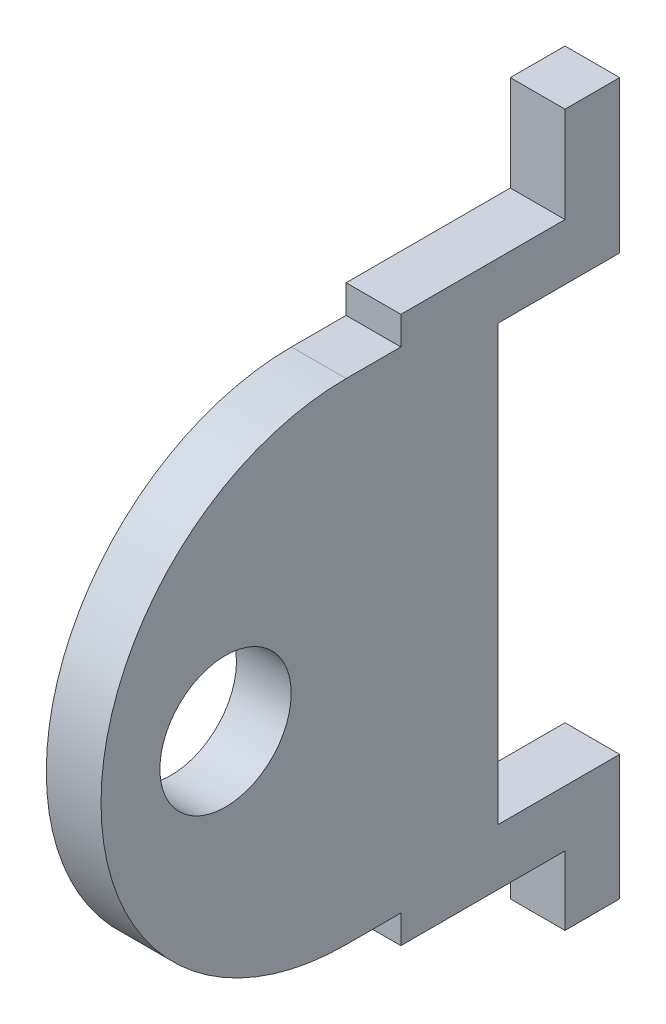
ISO-10303-21;
HEADER;
FILE_DESCRIPTION(('STEP AP214'),'2;1');
FILE_NAME('part.step','',(''),(''),'','','');
FILE_SCHEMA(('AUTOMOTIVE_DESIGN { 1 0 10303 214 1 1 1 1 }'));
ENDSEC;
DATA;
#1=APPLICATION_CONTEXT('core data for automotive mechanical design processes');
#2=APPLICATION_PROTOCOL_DEFINITION('international standard','automotive_design',2000,#1);
#3=PRODUCT_CONTEXT('',#1,'mechanical');
#4=PRODUCT('Part','Part','',(#3));
#5=PRODUCT_RELATED_PRODUCT_CATEGORY('part','',(#4));
#6=PRODUCT_DEFINITION_FORMATION('','',#4);
#7=PRODUCT_DEFINITION_CONTEXT('part definition',#1,'design');
#8=PRODUCT_DEFINITION('design','',#6,#7);
#9=PRODUCT_DEFINITION_SHAPE('','',#8);
#10=(LENGTH_UNIT() NAMED_UNIT(*) SI_UNIT(.MILLI.,.METRE.));
#11=(NAMED_UNIT(*) PLANE_ANGLE_UNIT() SI_UNIT($,.RADIAN.));
#12=(NAMED_UNIT(*) SI_UNIT($,.STERADIAN.) SOLID_ANGLE_UNIT());
#13=UNCERTAINTY_MEASURE_WITH_UNIT(LENGTH_MEASURE(1.E-05),#10,'distance_accuracy_value','');
#14=(GEOMETRIC_REPRESENTATION_CONTEXT(3) GLOBAL_UNCERTAINTY_ASSIGNED_CONTEXT((#13)) GLOBAL_UNIT_ASSIGNED_CONTEXT((#10,
#11,#12)) REPRESENTATION_CONTEXT('',''));
#15=CARTESIAN_POINT('',(0.,0.,0.));
#16=DIRECTION('',(0.,0.,1.));
#17=DIRECTION('',(1.,0.,0.));
#18=AXIS2_PLACEMENT_3D('',#15,#16,#17);
#19=CARTESIAN_POINT('',(-1.5875,-15.86484,12.7));
#20=DIRECTION('',(0.,0.,1.));
#21=DIRECTION('',(1.,0.,0.));
#22=AXIS2_PLACEMENT_3D('',#19,#20,#21);
#23=PLANE('',#22);
#24=DIRECTION('',(0.,-1.,0.));
#25=VECTOR('',#24,1.);
#26=CARTESIAN_POINT('',(1.5875,-15.86484,12.7));
#27=LINE('',#26,#25);
#28=CARTESIAN_POINT('',(1.5875,-14.224,12.7));
#29=VERTEX_POINT('',#28);
#30=CARTESIAN_POINT('',(1.5875,-15.86484,12.7));
#31=VERTEX_POINT('',#30);
#32=EDGE_CURVE('E170',#29,#31,#27,.T.);
#33=ORIENTED_EDGE('',*,*,#32,.F.);
#34=DIRECTION('',(-1.,0.,0.));
#35=VECTOR('',#34,1.);
#36=CARTESIAN_POINT('',(1.5875,-14.224,12.7));
#37=LINE('',#36,#35);
#38=CARTESIAN_POINT('',(-1.5875,-14.224,12.7));
#39=VERTEX_POINT('',#38);
#40=EDGE_CURVE('E290',#29,#39,#37,.T.);
#41=ORIENTED_EDGE('',*,*,#40,.T.);
#42=DIRECTION('',(0.,-1.,0.));
#43=VECTOR('',#42,1.);
#44=CARTESIAN_POINT('',(-1.5875,-15.86484,12.7));
#45=LINE('',#44,#43);
#46=CARTESIAN_POINT('',(-1.5875,-15.86484,12.7));
#47=VERTEX_POINT('',#46);
#48=EDGE_CURVE('E344',#39,#47,#45,.T.);
#49=ORIENTED_EDGE('',*,*,#48,.T.);
#50=DIRECTION('',(1.,0.,0.));
#51=VECTOR('',#50,1.);
#52=CARTESIAN_POINT('',(-1.5875,-15.86484,12.7));
#53=LINE('',#52,#51);
#54=EDGE_CURVE('E403',#47,#31,#53,.T.);
#55=ORIENTED_EDGE('',*,*,#54,.T.);
#56=EDGE_LOOP('',(#33,#41,#49,#55));
#57=FACE_BOUND('',#56,.T.);
#58=ADVANCED_FACE('F143',(#57),#23,.T.);
#59=CARTESIAN_POINT('',(-1.5875,-19.8628,0.));
#60=DIRECTION('',(0.,0.,-1.));
#61=DIRECTION('',(-1.,0.,0.));
#62=AXIS2_PLACEMENT_3D('',#59,#60,#61);
#63=PLANE('',#62);
#64=DIRECTION('',(0.,1.,0.));
#65=VECTOR('',#64,1.);
#66=CARTESIAN_POINT('',(1.5875,-19.8628,0.));
#67=LINE('',#66,#65);
#68=CARTESIAN_POINT('',(1.5875,-19.8628,0.));
#69=VERTEX_POINT('',#68);
#70=CARTESIAN_POINT('',(1.5875,-12.5984,0.));
#71=VERTEX_POINT('',#70);
#72=EDGE_CURVE('E310',#69,#71,#67,.T.);
#73=ORIENTED_EDGE('',*,*,#72,.F.);
#74=DIRECTION('',(1.,0.,0.));
#75=VECTOR('',#74,1.);
#76=CARTESIAN_POINT('',(-1.5875,-19.8628,0.));
#77=LINE('',#76,#75);
#78=CARTESIAN_POINT('',(-1.5875,-19.8628,0.));
#79=VERTEX_POINT('',#78);
#80=EDGE_CURVE('E12',#79,#69,#77,.T.);
#81=ORIENTED_EDGE('',*,*,#80,.F.);
#82=DIRECTION('',(0.,1.,0.));
#83=VECTOR('',#82,1.);
#84=CARTESIAN_POINT('',(-1.5875,-19.8628,0.));
#85=LINE('',#84,#83);
#86=CARTESIAN_POINT('',(-1.5875,-12.5984,0.));
#87=VERTEX_POINT('',#86);
#88=EDGE_CURVE('E309',#79,#87,#85,.T.);
#89=ORIENTED_EDGE('',*,*,#88,.T.);
#90=DIRECTION('',(1.,0.,0.));
#91=VECTOR('',#90,1.);
#92=CARTESIAN_POINT('',(-1.5875,-12.5984,0.));
#93=LINE('',#92,#91);
#94=EDGE_CURVE('E144',#87,#71,#93,.T.);
#95=ORIENTED_EDGE('',*,*,#94,.T.);
#96=EDGE_LOOP('',(#73,#81,#89,#95));
#97=FACE_BOUND('',#96,.T.);
#98=ADVANCED_FACE('F141',(#97),#63,.T.);
#99=CARTESIAN_POINT('',(-1.5875,-19.8628,0.));
#100=DIRECTION('',(0.,-1.,0.));
#101=DIRECTION('',(0.,0.,-1.));
#102=AXIS2_PLACEMENT_3D('',#99,#100,#101);
#103=PLANE('',#102);
#104=DIRECTION('',(0.,0.,-1.));
#105=VECTOR('',#104,1.);
#106=CARTESIAN_POINT('',(1.5875,-19.8628,0.));
#107=LINE('',#106,#105);
#108=CARTESIAN_POINT('',(1.5875,-19.8628,3.175));
#109=VERTEX_POINT('',#108);
#110=EDGE_CURVE('E312',#109,#69,#107,.T.);
#111=ORIENTED_EDGE('',*,*,#110,.F.);
#112=DIRECTION('',(1.,0.,0.));
#113=VECTOR('',#112,1.);
#114=CARTESIAN_POINT('',(-1.5875,-19.8628,3.175));
#115=LINE('',#114,#113);
#116=CARTESIAN_POINT('',(-1.5875,-19.8628,3.175));
#117=VERTEX_POINT('',#116);
#118=EDGE_CURVE('E151',#117,#109,#115,.T.);
#119=ORIENTED_EDGE('',*,*,#118,.F.);
#120=DIRECTION('',(0.,0.,-1.));
#121=VECTOR('',#120,1.);
#122=CARTESIAN_POINT('',(-1.5875,-19.8628,0.));
#123=LINE('',#122,#121);
#124=EDGE_CURVE('E353',#117,#79,#123,.T.);
#125=ORIENTED_EDGE('',*,*,#124,.T.);
#126=ORIENTED_EDGE('',*,*,#80,.T.);
#127=EDGE_LOOP('',(#111,#119,#125,#126));
#128=FACE_BOUND('',#127,.T.);
#129=ADVANCED_FACE('F442',(#128),#103,.T.);
#130=CARTESIAN_POINT('',(-1.5875,-19.8628,3.175));
#131=DIRECTION('',(0.,0.,1.));
#132=DIRECTION('',(1.,0.,0.));
#133=AXIS2_PLACEMENT_3D('',#130,#131,#132);
#134=PLANE('',#133);
#135=DIRECTION('',(0.,-1.,0.));
#136=VECTOR('',#135,1.);
#137=CARTESIAN_POINT('',(1.5875,-19.8628,3.175));
#138=LINE('',#137,#136);
#139=CARTESIAN_POINT('',(1.5875,-15.86484,3.175));
#140=VERTEX_POINT('',#139);
#141=EDGE_CURVE('E395',#140,#109,#138,.T.);
#142=ORIENTED_EDGE('',*,*,#141,.F.);
#143=DIRECTION('',(1.,0.,0.));
#144=VECTOR('',#143,1.);
#145=CARTESIAN_POINT('',(-1.5875,-15.86484,3.175));
#146=LINE('',#145,#144);
#147=CARTESIAN_POINT('',(-1.5875,-15.86484,3.175));
#148=VERTEX_POINT('',#147);
#149=EDGE_CURVE('E405',#148,#140,#146,.T.);
#150=ORIENTED_EDGE('',*,*,#149,.F.);
#151=DIRECTION('',(0.,-1.,0.));
#152=VECTOR('',#151,1.);
#153=CARTESIAN_POINT('',(-1.5875,-19.8628,3.175));
#154=LINE('',#153,#152);
#155=EDGE_CURVE('E348',#148,#117,#154,.T.);
#156=ORIENTED_EDGE('',*,*,#155,.T.);
#157=ORIENTED_EDGE('',*,*,#118,.T.);
#158=EDGE_LOOP('',(#142,#150,#156,#157));
#159=FACE_BOUND('',#158,.T.);
#160=ADVANCED_FACE('F481',(#159),#134,.T.);
#161=CARTESIAN_POINT('',(-1.5875,-15.86484,3.175));
#162=DIRECTION('',(0.,-1.,0.));
#163=DIRECTION('',(0.,0.,-1.));
#164=AXIS2_PLACEMENT_3D('',#161,#162,#163);
#165=PLANE('',#164);
#166=DIRECTION('',(0.,0.,-1.));
#167=VECTOR('',#166,1.);
#168=CARTESIAN_POINT('',(1.5875,-15.86484,3.175));
#169=LINE('',#168,#167);
#170=EDGE_CURVE('E386',#31,#140,#169,.T.);
#171=ORIENTED_EDGE('',*,*,#170,.F.);
#172=ORIENTED_EDGE('',*,*,#54,.F.);
#173=DIRECTION('',(0.,0.,-1.));
#174=VECTOR('',#173,1.);
#175=CARTESIAN_POINT('',(-1.5875,-15.86484,3.175));
#176=LINE('',#175,#174);
#177=EDGE_CURVE('E347',#47,#148,#176,.T.);
#178=ORIENTED_EDGE('',*,*,#177,.T.);
#179=ORIENTED_EDGE('',*,*,#149,.T.);
#180=EDGE_LOOP('',(#171,#172,#178,#179));
#181=FACE_BOUND('',#180,.T.);
#182=ADVANCED_FACE('F479',(#181),#165,.T.);
#183=DIRECTION('',(-1.,0.,0.));
#184=VECTOR('',#183,1.);
#185=CARTESIAN_POINT('',(1.5875,14.224,12.7));
#186=LINE('',#185,#184);
#187=CARTESIAN_POINT('',(1.5875,14.224,12.7));
#188=VERTEX_POINT('',#187);
#189=CARTESIAN_POINT('',(-1.5875,14.224,12.7));
#190=VERTEX_POINT('',#189);
#191=EDGE_CURVE('E276',#188,#190,#186,.T.);
#192=ORIENTED_EDGE('',*,*,#191,.F.);
#193=CARTESIAN_POINT('',(1.5875,15.86484,12.7));
#194=VERTEX_POINT('',#193);
#195=EDGE_CURVE('E266',#194,#188,#27,.T.);
#196=ORIENTED_EDGE('',*,*,#195,.F.);
#197=DIRECTION('',(1.,0.,0.));
#198=VECTOR('',#197,1.);
#199=CARTESIAN_POINT('',(-1.5875,15.86484,12.7));
#200=LINE('',#199,#198);
#201=CARTESIAN_POINT('',(-1.5875,15.86484,12.7));
#202=VERTEX_POINT('',#201);
#203=EDGE_CURVE('E410',#202,#194,#200,.T.);
#204=ORIENTED_EDGE('',*,*,#203,.F.);
#205=EDGE_CURVE('E157',#202,#190,#45,.T.);
#206=ORIENTED_EDGE('',*,*,#205,.T.);
#207=EDGE_LOOP('',(#192,#196,#204,#206));
#208=FACE_BOUND('',#207,.T.);
#209=ADVANCED_FACE('F468',(#208),#23,.T.);
#210=CARTESIAN_POINT('',(-1.5875,15.86484,12.7));
#211=DIRECTION('',(0.,1.,0.));
#212=DIRECTION('',(0.,0.,1.));
#213=AXIS2_PLACEMENT_3D('',#210,#211,#212);
#214=PLANE('',#213);
#215=DIRECTION('',(0.,0.,1.));
#216=VECTOR('',#215,1.);
#217=CARTESIAN_POINT('',(1.5875,15.86484,12.7));
#218=LINE('',#217,#216);
#219=CARTESIAN_POINT('',(1.5875,15.86484,3.175));
#220=VERTEX_POINT('',#219);
#221=EDGE_CURVE('E383',#220,#194,#218,.T.);
#222=ORIENTED_EDGE('',*,*,#221,.F.);
#223=DIRECTION('',(1.,0.,0.));
#224=VECTOR('',#223,1.);
#225=CARTESIAN_POINT('',(-1.5875,15.86484,3.175));
#226=LINE('',#225,#224);
#227=CARTESIAN_POINT('',(-1.5875,15.86484,3.175));
#228=VERTEX_POINT('',#227);
#229=EDGE_CURVE('E411',#228,#220,#226,.T.);
#230=ORIENTED_EDGE('',*,*,#229,.F.);
#231=DIRECTION('',(0.,0.,1.));
#232=VECTOR('',#231,1.);
#233=CARTESIAN_POINT('',(-1.5875,15.86484,12.7));
#234=LINE('',#233,#232);
#235=EDGE_CURVE('E338',#228,#202,#234,.T.);
#236=ORIENTED_EDGE('',*,*,#235,.T.);
#237=ORIENTED_EDGE('',*,*,#203,.T.);
#238=EDGE_LOOP('',(#222,#230,#236,#237));
#239=FACE_BOUND('',#238,.T.);
#240=ADVANCED_FACE('F469',(#239),#214,.T.);
#241=CARTESIAN_POINT('',(-1.5875,15.86484,3.175));
#242=DIRECTION('',(0.,0.,1.));
#243=DIRECTION('',(1.,0.,0.));
#244=AXIS2_PLACEMENT_3D('',#241,#242,#243);
#245=PLANE('',#244);
#246=DIRECTION('',(0.,-1.,0.));
#247=VECTOR('',#246,1.);
#248=CARTESIAN_POINT('',(1.5875,15.86484,3.175));
#249=LINE('',#248,#247);
#250=CARTESIAN_POINT('',(1.5875,21.4122,3.175));
#251=VERTEX_POINT('',#250);
#252=EDGE_CURVE('E379',#251,#220,#249,.T.);
#253=ORIENTED_EDGE('',*,*,#252,.F.);
#254=DIRECTION('',(1.,0.,0.));
#255=VECTOR('',#254,1.);
#256=CARTESIAN_POINT('',(-1.5875,21.4122,3.175));
#257=LINE('',#256,#255);
#258=CARTESIAN_POINT('',(-1.5875,21.4122,3.175));
#259=VERTEX_POINT('',#258);
#260=EDGE_CURVE('E413',#259,#251,#257,.T.);
#261=ORIENTED_EDGE('',*,*,#260,.F.);
#262=DIRECTION('',(0.,-1.,0.));
#263=VECTOR('',#262,1.);
#264=CARTESIAN_POINT('',(-1.5875,15.86484,3.175));
#265=LINE('',#264,#263);
#266=EDGE_CURVE('E333',#259,#228,#265,.T.);
#267=ORIENTED_EDGE('',*,*,#266,.T.);
#268=ORIENTED_EDGE('',*,*,#229,.T.);
#269=EDGE_LOOP('',(#253,#261,#267,#268));
#270=FACE_BOUND('',#269,.T.);
#271=ADVANCED_FACE('F463',(#270),#245,.T.);
#272=CARTESIAN_POINT('',(-1.5875,21.4122,3.175));
#273=DIRECTION('',(0.,1.,0.));
#274=DIRECTION('',(0.,0.,1.));
#275=AXIS2_PLACEMENT_3D('',#272,#273,#274);
#276=PLANE('',#275);
#277=DIRECTION('',(0.,0.,1.));
#278=VECTOR('',#277,1.);
#279=CARTESIAN_POINT('',(1.5875,21.4122,3.175));
#280=LINE('',#279,#278);
#281=CARTESIAN_POINT('',(1.5875,21.4122,0.));
#282=VERTEX_POINT('',#281);
#283=EDGE_CURVE('E376',#282,#251,#280,.T.);
#284=ORIENTED_EDGE('',*,*,#283,.F.);
#285=DIRECTION('',(1.,0.,0.));
#286=VECTOR('',#285,1.);
#287=CARTESIAN_POINT('',(-1.5875,21.4122,0.));
#288=LINE('',#287,#286);
#289=CARTESIAN_POINT('',(-1.5875,21.4122,0.));
#290=VERTEX_POINT('',#289);
#291=EDGE_CURVE('E417',#290,#282,#288,.T.);
#292=ORIENTED_EDGE('',*,*,#291,.F.);
#293=DIRECTION('',(0.,0.,1.));
#294=VECTOR('',#293,1.);
#295=CARTESIAN_POINT('',(-1.5875,21.4122,3.175));
#296=LINE('',#295,#294);
#297=EDGE_CURVE('E332',#290,#259,#296,.T.);
#298=ORIENTED_EDGE('',*,*,#297,.T.);
#299=ORIENTED_EDGE('',*,*,#260,.T.);
#300=EDGE_LOOP('',(#284,#292,#298,#299));
#301=FACE_BOUND('',#300,.T.);
#302=ADVANCED_FACE('F458',(#301),#276,.T.);
#303=CARTESIAN_POINT('',(-1.5875,12.5984,0.));
#304=DIRECTION('',(0.,0.,-1.));
#305=DIRECTION('',(-1.,0.,0.));
#306=AXIS2_PLACEMENT_3D('',#303,#304,#305);
#307=PLANE('',#306);
#308=DIRECTION('',(0.,1.,0.));
#309=VECTOR('',#308,1.);
#310=CARTESIAN_POINT('',(1.5875,12.5984,0.));
#311=LINE('',#310,#309);
#312=CARTESIAN_POINT('',(1.5875,12.5984,0.));
#313=VERTEX_POINT('',#312);
#314=EDGE_CURVE('E375',#313,#282,#311,.T.);
#315=ORIENTED_EDGE('',*,*,#314,.F.);
#316=DIRECTION('',(1.,0.,0.));
#317=VECTOR('',#316,1.);
#318=CARTESIAN_POINT('',(-1.5875,12.5984,0.));
#319=LINE('',#318,#317);
#320=CARTESIAN_POINT('',(-1.5875,12.5984,0.));
#321=VERTEX_POINT('',#320);
#322=EDGE_CURVE('E419',#321,#313,#319,.T.);
#323=ORIENTED_EDGE('',*,*,#322,.F.);
#324=DIRECTION('',(0.,1.,0.));
#325=VECTOR('',#324,1.);
#326=CARTESIAN_POINT('',(-1.5875,12.5984,0.));
#327=LINE('',#326,#325);
#328=EDGE_CURVE('E330',#321,#290,#327,.T.);
#329=ORIENTED_EDGE('',*,*,#328,.T.);
#330=ORIENTED_EDGE('',*,*,#291,.T.);
#331=EDGE_LOOP('',(#315,#323,#329,#330));
#332=FACE_BOUND('',#331,.T.);
#333=ADVANCED_FACE('F457',(#332),#307,.T.);
#334=CARTESIAN_POINT('',(-1.5875,12.5984,7.0612));
#335=DIRECTION('',(0.,-1.,0.));
#336=DIRECTION('',(0.,0.,-1.));
#337=AXIS2_PLACEMENT_3D('',#334,#335,#336);
#338=PLANE('',#337);
#339=DIRECTION('',(0.,0.,-1.));
#340=VECTOR('',#339,1.);
#341=CARTESIAN_POINT('',(1.5875,12.5984,7.0612));
#342=LINE('',#341,#340);
#343=CARTESIAN_POINT('',(1.5875,12.5984,7.0612));
#344=VERTEX_POINT('',#343);
#345=EDGE_CURVE('E366',#344,#313,#342,.T.);
#346=ORIENTED_EDGE('',*,*,#345,.F.);
#347=DIRECTION('',(1.,0.,0.));
#348=VECTOR('',#347,1.);
#349=CARTESIAN_POINT('',(-1.5875,12.5984,7.0612));
#350=LINE('',#349,#348);
#351=CARTESIAN_POINT('',(-1.5875,12.5984,7.0612));
#352=VERTEX_POINT('',#351);
#353=EDGE_CURVE('E421',#352,#344,#350,.T.);
#354=ORIENTED_EDGE('',*,*,#353,.F.);
#355=DIRECTION('',(0.,0.,-1.));
#356=VECTOR('',#355,1.);
#357=CARTESIAN_POINT('',(-1.5875,12.5984,7.0612));
#358=LINE('',#357,#356);
#359=EDGE_CURVE('E323',#352,#321,#358,.T.);
#360=ORIENTED_EDGE('',*,*,#359,.T.);
#361=ORIENTED_EDGE('',*,*,#322,.T.);
#362=EDGE_LOOP('',(#346,#354,#360,#361));
#363=FACE_BOUND('',#362,.T.);
#364=ADVANCED_FACE('F453',(#363),#338,.T.);
#365=CARTESIAN_POINT('',(-1.5875,-12.5984,7.0612));
#366=DIRECTION('',(0.,0.,-1.));
#367=DIRECTION('',(-1.,0.,0.));
#368=AXIS2_PLACEMENT_3D('',#365,#366,#367);
#369=PLANE('',#368);
#370=DIRECTION('',(0.,1.,0.));
#371=VECTOR('',#370,1.);
#372=CARTESIAN_POINT('',(1.5875,-12.5984,7.0612));
#373=LINE('',#372,#371);
#374=CARTESIAN_POINT('',(1.5875,-12.5984,7.0612));
#375=VERTEX_POINT('',#374);
#376=EDGE_CURVE('E365',#375,#344,#373,.T.);
#377=ORIENTED_EDGE('',*,*,#376,.F.);
#378=DIRECTION('',(1.,0.,0.));
#379=VECTOR('',#378,1.);
#380=CARTESIAN_POINT('',(-1.5875,-12.5984,7.0612));
#381=LINE('',#380,#379);
#382=CARTESIAN_POINT('',(-1.5875,-12.5984,7.0612));
#383=VERTEX_POINT('',#382);
#384=EDGE_CURVE('E422',#383,#375,#381,.T.);
#385=ORIENTED_EDGE('',*,*,#384,.F.);
#386=DIRECTION('',(0.,1.,0.));
#387=VECTOR('',#386,1.);
#388=CARTESIAN_POINT('',(-1.5875,-12.5984,7.0612));
#389=LINE('',#388,#387);
#390=EDGE_CURVE('E317',#383,#352,#389,.T.);
#391=ORIENTED_EDGE('',*,*,#390,.T.);
#392=ORIENTED_EDGE('',*,*,#353,.T.);
#393=EDGE_LOOP('',(#377,#385,#391,#392));
#394=FACE_BOUND('',#393,.T.);
#395=ADVANCED_FACE('F447',(#394),#369,.T.);
#396=CARTESIAN_POINT('',(-1.5875,-12.5984,0.));
#397=DIRECTION('',(0.,1.,0.));
#398=DIRECTION('',(0.,0.,1.));
#399=AXIS2_PLACEMENT_3D('',#396,#397,#398);
#400=PLANE('',#399);
#401=DIRECTION('',(0.,0.,1.));
#402=VECTOR('',#401,1.);
#403=CARTESIAN_POINT('',(1.5875,-12.5984,0.));
#404=LINE('',#403,#402);
#405=EDGE_CURVE('E360',#71,#375,#404,.T.);
#406=ORIENTED_EDGE('',*,*,#405,.F.);
#407=ORIENTED_EDGE('',*,*,#94,.F.);
#408=DIRECTION('',(0.,0.,1.));
#409=VECTOR('',#408,1.);
#410=CARTESIAN_POINT('',(-1.5875,-12.5984,0.));
#411=LINE('',#410,#409);
#412=EDGE_CURVE('E314',#87,#383,#411,.T.);
#413=ORIENTED_EDGE('',*,*,#412,.T.);
#414=ORIENTED_EDGE('',*,*,#384,.T.);
#415=EDGE_LOOP('',(#406,#407,#413,#414));
#416=FACE_BOUND('',#415,.T.);
#417=ADVANCED_FACE('F440',(#416),#400,.T.);
#418=CARTESIAN_POINT('',(-1.5875,0.,0.));
#419=DIRECTION('',(1.,0.,0.));
#420=DIRECTION('',(0.,0.,-1.));
#421=AXIS2_PLACEMENT_3D('',#418,#419,#420);
#422=PLANE('',#421);
#423=CARTESIAN_POINT('',(-1.5875,0.,22.8736242036665));
#424=DIRECTION('',(1.,0.,0.));
#425=DIRECTION('',(0.,0.,-1.));
#426=AXIS2_PLACEMENT_3D('',#423,#424,#425);
#427=CIRCLE('',#426,3.81);
#428=CARTESIAN_POINT('',(-1.5875,0.,19.0636242036665));
#429=VERTEX_POINT('',#428);
#430=EDGE_CURVE('E296',#429,#429,#427,.T.);
#431=ORIENTED_EDGE('',*,*,#430,.T.);
#432=EDGE_LOOP('',(#431));
#433=FACE_BOUND('',#432,.T.);
#434=ORIENTED_EDGE('',*,*,#88,.F.);
#435=ORIENTED_EDGE('',*,*,#124,.F.);
#436=ORIENTED_EDGE('',*,*,#155,.F.);
#437=ORIENTED_EDGE('',*,*,#177,.F.);
#438=ORIENTED_EDGE('',*,*,#48,.F.);
#439=DIRECTION('',(0.,0.,-1.));
#440=VECTOR('',#439,1.);
#441=CARTESIAN_POINT('',(-1.5875,-14.224,12.7));
#442=LINE('',#441,#440);
#443=CARTESIAN_POINT('',(-1.5875,-14.224,15.875));
#444=VERTEX_POINT('',#443);
#445=EDGE_CURVE('E267',#444,#39,#442,.T.);
#446=ORIENTED_EDGE('',*,*,#445,.F.);
#447=CARTESIAN_POINT('',(-1.5875,0.,15.875));
#448=DIRECTION('',(1.,0.,0.));
#449=DIRECTION('',(0.,0.,1.));
#450=AXIS2_PLACEMENT_3D('',#447,#448,#449);
#451=CIRCLE('',#450,14.224);
#452=CARTESIAN_POINT('',(-1.5875,14.224,15.875));
#453=VERTEX_POINT('',#452);
#454=EDGE_CURVE('E299',#453,#444,#451,.T.);
#455=ORIENTED_EDGE('',*,*,#454,.F.);
#456=DIRECTION('',(0.,0.,1.));
#457=VECTOR('',#456,1.);
#458=CARTESIAN_POINT('',(-1.5875,14.224,15.875));
#459=LINE('',#458,#457);
#460=EDGE_CURVE('E274',#190,#453,#459,.T.);
#461=ORIENTED_EDGE('',*,*,#460,.F.);
#462=ORIENTED_EDGE('',*,*,#205,.F.);
#463=ORIENTED_EDGE('',*,*,#235,.F.);
#464=ORIENTED_EDGE('',*,*,#266,.F.);
#465=ORIENTED_EDGE('',*,*,#297,.F.);
#466=ORIENTED_EDGE('',*,*,#328,.F.);
#467=ORIENTED_EDGE('',*,*,#359,.F.);
#468=ORIENTED_EDGE('',*,*,#390,.F.);
#469=ORIENTED_EDGE('',*,*,#412,.F.);
#470=EDGE_LOOP('',(#434,#435,#436,#437,#438,#446,#455,#461,#462,#463,#464,#465,#466,#467,#468,#469));
#471=FACE_BOUND('',#470,.T.);
#472=ADVANCED_FACE('F441',(#433,#471),#422,.F.);
#473=CARTESIAN_POINT('',(1.5875,0.,0.));
#474=DIRECTION('',(1.,0.,0.));
#475=DIRECTION('',(0.,0.,-1.));
#476=AXIS2_PLACEMENT_3D('',#473,#474,#475);
#477=PLANE('',#476);
#478=CARTESIAN_POINT('',(1.5875,0.,22.8736242036665));
#479=DIRECTION('',(1.,0.,0.));
#480=DIRECTION('',(0.,0.,-1.));
#481=AXIS2_PLACEMENT_3D('',#478,#479,#480);
#482=CIRCLE('',#481,3.81);
#483=CARTESIAN_POINT('',(1.5875,0.,19.0636242036665));
#484=VERTEX_POINT('',#483);
#485=EDGE_CURVE('E571',#484,#484,#482,.T.);
#486=ORIENTED_EDGE('',*,*,#485,.F.);
#487=EDGE_LOOP('',(#486));
#488=FACE_BOUND('',#487,.T.);
#489=ORIENTED_EDGE('',*,*,#72,.T.);
#490=ORIENTED_EDGE('',*,*,#405,.T.);
#491=ORIENTED_EDGE('',*,*,#376,.T.);
#492=ORIENTED_EDGE('',*,*,#345,.T.);
#493=ORIENTED_EDGE('',*,*,#314,.T.);
#494=ORIENTED_EDGE('',*,*,#283,.T.);
#495=ORIENTED_EDGE('',*,*,#252,.T.);
#496=ORIENTED_EDGE('',*,*,#221,.T.);
#497=ORIENTED_EDGE('',*,*,#195,.T.);
#498=DIRECTION('',(0.,0.,1.));
#499=VECTOR('',#498,1.);
#500=CARTESIAN_POINT('',(1.5875,14.224,15.875));
#501=LINE('',#500,#499);
#502=CARTESIAN_POINT('',(1.5875,14.224,15.875));
#503=VERTEX_POINT('',#502);
#504=EDGE_CURVE('E260',#188,#503,#501,.T.);
#505=ORIENTED_EDGE('',*,*,#504,.T.);
#506=CARTESIAN_POINT('',(1.5875,0.,15.875));
#507=DIRECTION('',(1.,0.,0.));
#508=DIRECTION('',(0.,0.,1.));
#509=AXIS2_PLACEMENT_3D('',#506,#507,#508);
#510=CIRCLE('',#509,14.224);
#511=CARTESIAN_POINT('',(1.5875,-14.224,15.875));
#512=VERTEX_POINT('',#511);
#513=EDGE_CURVE('E265',#503,#512,#510,.T.);
#514=ORIENTED_EDGE('',*,*,#513,.T.);
#515=DIRECTION('',(0.,0.,-1.));
#516=VECTOR('',#515,1.);
#517=CARTESIAN_POINT('',(1.5875,-14.224,12.7));
#518=LINE('',#517,#516);
#519=EDGE_CURVE('E286',#512,#29,#518,.T.);
#520=ORIENTED_EDGE('',*,*,#519,.T.);
#521=ORIENTED_EDGE('',*,*,#32,.T.);
#522=ORIENTED_EDGE('',*,*,#170,.T.);
#523=ORIENTED_EDGE('',*,*,#141,.T.);
#524=ORIENTED_EDGE('',*,*,#110,.T.);
#525=EDGE_LOOP('',(#489,#490,#491,#492,#493,#494,#495,#496,#497,#505,#514,#520,#521,#522,#523,#524));
#526=FACE_BOUND('',#525,.T.);
#527=ADVANCED_FACE('F257',(#488,#526),#477,.T.);
#528=CARTESIAN_POINT('',(1.5875,14.224,15.875));
#529=DIRECTION('',(0.,-1.,0.));
#530=DIRECTION('',(0.,0.,-1.));
#531=AXIS2_PLACEMENT_3D('',#528,#529,#530);
#532=PLANE('',#531);
#533=ORIENTED_EDGE('',*,*,#460,.T.);
#534=DIRECTION('',(-1.,0.,0.));
#535=VECTOR('',#534,1.);
#536=CARTESIAN_POINT('',(1.5875,14.224,15.875));
#537=LINE('',#536,#535);
#538=EDGE_CURVE('E275',#503,#453,#537,.T.);
#539=ORIENTED_EDGE('',*,*,#538,.F.);
#540=ORIENTED_EDGE('',*,*,#504,.F.);
#541=ORIENTED_EDGE('',*,*,#191,.T.);
#542=EDGE_LOOP('',(#533,#539,#540,#541));
#543=FACE_BOUND('',#542,.T.);
#544=ADVANCED_FACE('F272',(#543),#532,.F.);
#545=CARTESIAN_POINT('',(1.5875,0.,15.875));
#546=DIRECTION('',(-1.,0.,0.));
#547=DIRECTION('',(0.,0.,1.));
#548=AXIS2_PLACEMENT_3D('',#545,#546,#547);
#549=CYLINDRICAL_SURFACE('',#548,14.224);
#550=ORIENTED_EDGE('',*,*,#454,.T.);
#551=DIRECTION('',(-1.,0.,0.));
#552=VECTOR('',#551,1.);
#553=CARTESIAN_POINT('',(1.5875,-14.224,15.875));
#554=LINE('',#553,#552);
#555=EDGE_CURVE('E278',#512,#444,#554,.T.);
#556=ORIENTED_EDGE('',*,*,#555,.F.);
#557=ORIENTED_EDGE('',*,*,#513,.F.);
#558=ORIENTED_EDGE('',*,*,#538,.T.);
#559=EDGE_LOOP('',(#550,#556,#557,#558));
#560=FACE_BOUND('',#559,.T.);
#561=ADVANCED_FACE('F281',(#560),#549,.T.);
#562=CARTESIAN_POINT('',(1.5875,-14.224,12.7));
#563=DIRECTION('',(0.,1.,0.));
#564=DIRECTION('',(0.,0.,1.));
#565=AXIS2_PLACEMENT_3D('',#562,#563,#564);
#566=PLANE('',#565);
#567=ORIENTED_EDGE('',*,*,#445,.T.);
#568=ORIENTED_EDGE('',*,*,#40,.F.);
#569=ORIENTED_EDGE('',*,*,#519,.F.);
#570=ORIENTED_EDGE('',*,*,#555,.T.);
#571=EDGE_LOOP('',(#567,#568,#569,#570));
#572=FACE_BOUND('',#571,.T.);
#573=ADVANCED_FACE('F472',(#572),#566,.F.);
#574=CARTESIAN_POINT('',(-1.5875,0.,22.8736242036665));
#575=DIRECTION('',(1.,0.,0.));
#576=DIRECTION('',(0.,0.,-1.));
#577=AXIS2_PLACEMENT_3D('',#574,#575,#576);
#578=CYLINDRICAL_SURFACE('',#577,3.81);
#579=ORIENTED_EDGE('',*,*,#430,.F.);
#580=EDGE_LOOP('',(#579));
#581=FACE_BOUND('',#580,.T.);
#582=ORIENTED_EDGE('',*,*,#485,.T.);
#583=EDGE_LOOP('',(#582));
#584=FACE_BOUND('',#583,.T.);
#585=ADVANCED_FACE('F564',(#581,#584),#578,.F.);
#586=CLOSED_SHELL('',(#58,#98,#129,#160,#182,#209,#240,#271,#302,#333,#364,#395,#417,#472,#527,
#544,#561,#573,#585));
#587=MANIFOLD_SOLID_BREP('B2',#586);
#588=ADVANCED_BREP_SHAPE_REPRESENTATION('',(#18,#587),#14);
#589=SHAPE_DEFINITION_REPRESENTATION(#9,#588);
ENDSEC;
END-ISO-10303-21;
